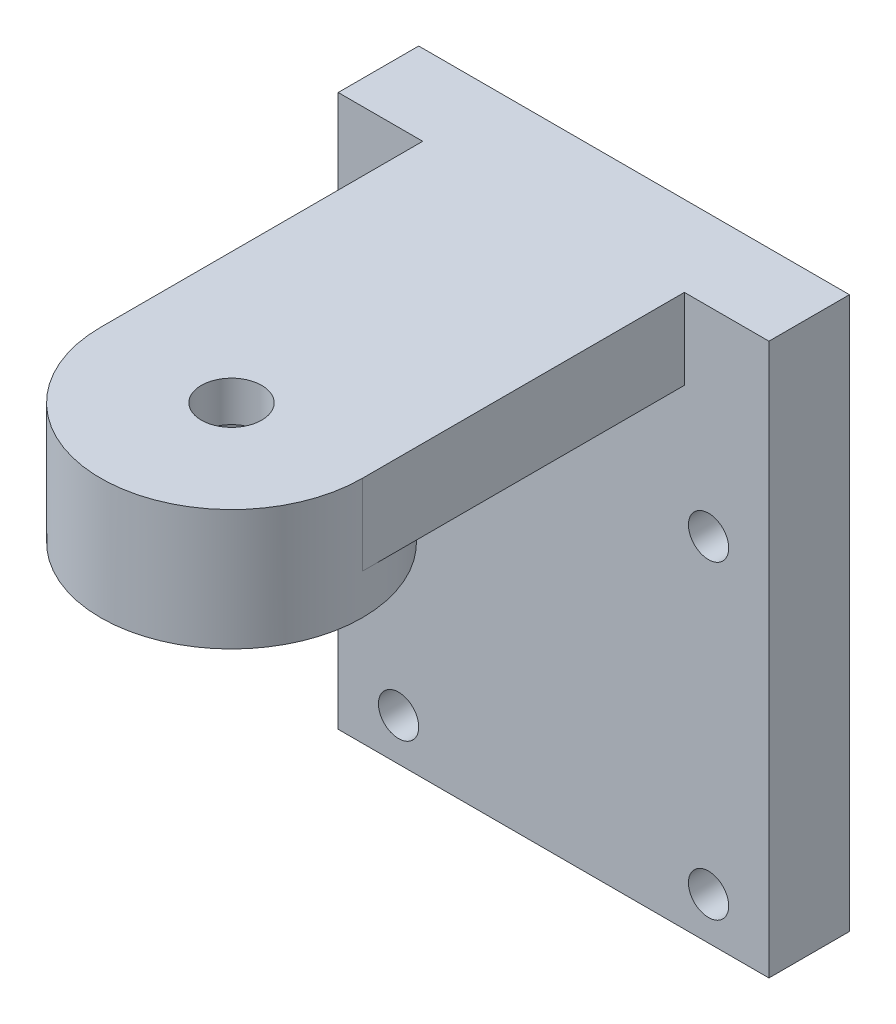
ISO-10303-21;
HEADER;
FILE_DESCRIPTION(('STEP AP214'),'2;1');
FILE_NAME('part.step','',(''),(''),'','','');
FILE_SCHEMA(('AUTOMOTIVE_DESIGN { 1 0 10303 214 1 1 1 1 }'));
ENDSEC;
DATA;
#1=APPLICATION_CONTEXT('core data for automotive mechanical design processes');
#2=APPLICATION_PROTOCOL_DEFINITION('international standard','automotive_design',2000,#1);
#3=PRODUCT_CONTEXT('',#1,'mechanical');
#4=PRODUCT('Part','Part','',(#3));
#5=PRODUCT_RELATED_PRODUCT_CATEGORY('part','',(#4));
#6=PRODUCT_DEFINITION_FORMATION('','',#4);
#7=PRODUCT_DEFINITION_CONTEXT('part definition',#1,'design');
#8=PRODUCT_DEFINITION('design','',#6,#7);
#9=PRODUCT_DEFINITION_SHAPE('','',#8);
#10=(LENGTH_UNIT() NAMED_UNIT(*) SI_UNIT(.MILLI.,.METRE.));
#11=(NAMED_UNIT(*) PLANE_ANGLE_UNIT() SI_UNIT($,.RADIAN.));
#12=(NAMED_UNIT(*) SI_UNIT($,.STERADIAN.) SOLID_ANGLE_UNIT());
#13=UNCERTAINTY_MEASURE_WITH_UNIT(LENGTH_MEASURE(1.E-05),#10,'distance_accuracy_value','');
#14=(GEOMETRIC_REPRESENTATION_CONTEXT(3) GLOBAL_UNCERTAINTY_ASSIGNED_CONTEXT((#13)) GLOBAL_UNIT_ASSIGNED_CONTEXT((#10,
#11,#12)) REPRESENTATION_CONTEXT('',''));
#15=CARTESIAN_POINT('',(0.,0.,0.));
#16=DIRECTION('',(0.,0.,1.));
#17=DIRECTION('',(1.,0.,0.));
#18=AXIS2_PLACEMENT_3D('',#15,#16,#17);
#19=CARTESIAN_POINT('',(6.5,2.,0.));
#20=DIRECTION('',(1.,0.,0.));
#21=DIRECTION('',(0.,0.,-1.));
#22=AXIS2_PLACEMENT_3D('',#19,#20,#21);
#23=PLANE('',#22);
#24=DIRECTION('',(0.,0.,-1.));
#25=VECTOR('',#24,1.);
#26=CARTESIAN_POINT('',(6.5,2.,0.));
#27=LINE('',#26,#25);
#28=CARTESIAN_POINT('',(6.5,2.,0.));
#29=VERTEX_POINT('',#28);
#30=CARTESIAN_POINT('',(6.5,2.,-16.));
#31=VERTEX_POINT('',#30);
#32=EDGE_CURVE('E225',#29,#31,#27,.T.);
#33=ORIENTED_EDGE('',*,*,#32,.T.);
#34=DIRECTION('',(0.,-1.,0.));
#35=VECTOR('',#34,1.);
#36=CARTESIAN_POINT('',(6.5,0.,-16.));
#37=LINE('',#36,#35);
#38=CARTESIAN_POINT('',(6.5,6.,-16.));
#39=VERTEX_POINT('',#38);
#40=EDGE_CURVE('E61',#39,#31,#37,.T.);
#41=ORIENTED_EDGE('',*,*,#40,.F.);
#42=DIRECTION('',(0.,0.,-1.));
#43=VECTOR('',#42,1.);
#44=CARTESIAN_POINT('',(6.5,6.,0.));
#45=LINE('',#44,#43);
#46=CARTESIAN_POINT('',(6.5,6.,0.));
#47=VERTEX_POINT('',#46);
#48=EDGE_CURVE('E222',#47,#39,#45,.T.);
#49=ORIENTED_EDGE('',*,*,#48,.F.);
#50=DIRECTION('',(0.,1.,0.));
#51=VECTOR('',#50,1.);
#52=CARTESIAN_POINT('',(6.5,2.,0.));
#53=LINE('',#52,#51);
#54=EDGE_CURVE('E235',#29,#47,#53,.T.);
#55=ORIENTED_EDGE('',*,*,#54,.F.);
#56=EDGE_LOOP('',(#33,#41,#49,#55));
#57=FACE_BOUND('',#56,.T.);
#58=ADVANCED_FACE('F43',(#57),#23,.T.);
#59=CARTESIAN_POINT('',(-6.5,2.,0.));
#60=DIRECTION('',(1.,0.,0.));
#61=DIRECTION('',(0.,0.,-1.));
#62=AXIS2_PLACEMENT_3D('',#59,#60,#61);
#63=PLANE('',#62);
#64=DIRECTION('',(0.,1.,0.));
#65=VECTOR('',#64,1.);
#66=CARTESIAN_POINT('',(-6.5,0.,-16.));
#67=LINE('',#66,#65);
#68=CARTESIAN_POINT('',(-6.5,2.,-16.));
#69=VERTEX_POINT('',#68);
#70=CARTESIAN_POINT('',(-6.5,6.,-16.));
#71=VERTEX_POINT('',#70);
#72=EDGE_CURVE('E193',#69,#71,#67,.T.);
#73=ORIENTED_EDGE('',*,*,#72,.F.);
#74=DIRECTION('',(0.,0.,-1.));
#75=VECTOR('',#74,1.);
#76=CARTESIAN_POINT('',(-6.5,2.,0.));
#77=LINE('',#76,#75);
#78=CARTESIAN_POINT('',(-6.5,2.,0.));
#79=VERTEX_POINT('',#78);
#80=EDGE_CURVE('E217',#79,#69,#77,.T.);
#81=ORIENTED_EDGE('',*,*,#80,.F.);
#82=DIRECTION('',(0.,1.,0.));
#83=VECTOR('',#82,1.);
#84=CARTESIAN_POINT('',(-6.5,2.,0.));
#85=LINE('',#84,#83);
#86=CARTESIAN_POINT('',(-6.5,6.,0.));
#87=VERTEX_POINT('',#86);
#88=EDGE_CURVE('E228',#79,#87,#85,.T.);
#89=ORIENTED_EDGE('',*,*,#88,.T.);
#90=DIRECTION('',(0.,0.,-1.));
#91=VECTOR('',#90,1.);
#92=CARTESIAN_POINT('',(-6.5,6.,0.));
#93=LINE('',#92,#91);
#94=EDGE_CURVE('E69',#87,#71,#93,.T.);
#95=ORIENTED_EDGE('',*,*,#94,.T.);
#96=EDGE_LOOP('',(#73,#81,#89,#95));
#97=FACE_BOUND('',#96,.T.);
#98=ADVANCED_FACE('F355',(#97),#63,.F.);
#99=CARTESIAN_POINT('',(0.,2.,0.));
#100=DIRECTION('',(0.,1.,0.));
#101=DIRECTION('',(0.,0.,1.));
#102=AXIS2_PLACEMENT_3D('',#99,#100,#101);
#103=PLANE('',#102);
#104=DIRECTION('',(-1.,0.,0.));
#105=VECTOR('',#104,1.);
#106=CARTESIAN_POINT('',(0.,2.,-16.));
#107=LINE('',#106,#105);
#108=EDGE_CURVE('E196',#31,#69,#107,.T.);
#109=ORIENTED_EDGE('',*,*,#108,.F.);
#110=ORIENTED_EDGE('',*,*,#32,.F.);
#111=CARTESIAN_POINT('',(0.,2.,0.));
#112=DIRECTION('',(0.,1.,0.));
#113=DIRECTION('',(0.,0.,1.));
#114=AXIS2_PLACEMENT_3D('',#111,#112,#113);
#115=CIRCLE('',#114,6.5);
#116=EDGE_CURVE('E221',#29,#79,#115,.T.);
#117=ORIENTED_EDGE('',*,*,#116,.T.);
#118=ORIENTED_EDGE('',*,*,#80,.T.);
#119=EDGE_LOOP('',(#109,#110,#117,#118));
#120=FACE_BOUND('',#119,.T.);
#121=ADVANCED_FACE('F360',(#120),#103,.F.);
#122=CARTESIAN_POINT('',(0.,6.,0.));
#123=DIRECTION('',(0.,-1.,0.));
#124=DIRECTION('',(0.,0.,-1.));
#125=AXIS2_PLACEMENT_3D('',#122,#123,#124);
#126=CYLINDRICAL_SURFACE('',#125,6.5);
#127=CARTESIAN_POINT('',(0.,0.,0.));
#128=DIRECTION('',(0.,1.,0.));
#129=DIRECTION('',(0.,0.,1.));
#130=AXIS2_PLACEMENT_3D('',#127,#128,#129);
#131=CIRCLE('',#130,6.5);
#132=CARTESIAN_POINT('',(0.,0.,6.5));
#133=VERTEX_POINT('',#132);
#134=EDGE_CURVE('E53',#133,#133,#131,.T.);
#135=ORIENTED_EDGE('',*,*,#134,.T.);
#136=EDGE_LOOP('',(#135));
#137=FACE_BOUND('',#136,.T.);
#138=ORIENTED_EDGE('',*,*,#54,.T.);
#139=CARTESIAN_POINT('',(0.,6.,0.));
#140=DIRECTION('',(0.,1.,0.));
#141=DIRECTION('',(0.,0.,1.));
#142=AXIS2_PLACEMENT_3D('',#139,#140,#141);
#143=CIRCLE('',#142,6.5);
#144=EDGE_CURVE('E11',#87,#47,#143,.T.);
#145=ORIENTED_EDGE('',*,*,#144,.F.);
#146=ORIENTED_EDGE('',*,*,#88,.F.);
#147=ORIENTED_EDGE('',*,*,#116,.F.);
#148=EDGE_LOOP('',(#138,#145,#146,#147));
#149=FACE_BOUND('',#148,.T.);
#150=ADVANCED_FACE('F45',(#137,#149),#126,.T.);
#151=CARTESIAN_POINT('',(0.,0.,0.));
#152=DIRECTION('',(0.,1.,0.));
#153=DIRECTION('',(0.,0.,1.));
#154=AXIS2_PLACEMENT_3D('',#151,#152,#153);
#155=PLANE('',#154);
#156=ORIENTED_EDGE('',*,*,#134,.F.);
#157=EDGE_LOOP('',(#156));
#158=FACE_BOUND('',#157,.T.);
#159=DIRECTION('',(0.5,0.,-0.866025403784439));
#160=VECTOR('',#159,1.);
#161=CARTESIAN_POINT('',(5.,0.,0.));
#162=LINE('',#161,#160);
#163=CARTESIAN_POINT('',(2.5,0.,4.3301270189222));
#164=VERTEX_POINT('',#163);
#165=CARTESIAN_POINT('',(5.,0.,0.));
#166=VERTEX_POINT('',#165);
#167=EDGE_CURVE('E266',#164,#166,#162,.T.);
#168=ORIENTED_EDGE('',*,*,#167,.T.);
#169=DIRECTION('',(-0.500000000000004,0.,-0.866025403784436));
#170=VECTOR('',#169,1.);
#171=CARTESIAN_POINT('',(5.,0.,0.));
#172=LINE('',#171,#170);
#173=CARTESIAN_POINT('',(2.49999999999998,0.,-4.33012701892218));
#174=VERTEX_POINT('',#173);
#175=EDGE_CURVE('E270',#166,#174,#172,.T.);
#176=ORIENTED_EDGE('',*,*,#175,.T.);
#177=DIRECTION('',(-1.,0.,0.));
#178=VECTOR('',#177,1.);
#179=CARTESIAN_POINT('',(2.49999999999998,0.,-4.33012701892218));
#180=LINE('',#179,#178);
#181=CARTESIAN_POINT('',(-2.5,0.,-4.33012701892219));
#182=VERTEX_POINT('',#181);
#183=EDGE_CURVE('E274',#174,#182,#180,.T.);
#184=ORIENTED_EDGE('',*,*,#183,.T.);
#185=DIRECTION('',(-0.500000000000004,0.,0.866025403784436));
#186=VECTOR('',#185,1.);
#187=CARTESIAN_POINT('',(-2.5,0.,-4.33012701892219));
#188=LINE('',#187,#186);
#189=CARTESIAN_POINT('',(-5.00000000000002,0.,0.));
#190=VERTEX_POINT('',#189);
#191=EDGE_CURVE('E278',#182,#190,#188,.T.);
#192=ORIENTED_EDGE('',*,*,#191,.T.);
#193=DIRECTION('',(0.5,0.,0.866025403784439));
#194=VECTOR('',#193,1.);
#195=CARTESIAN_POINT('',(-5.00000000000002,0.,0.));
#196=LINE('',#195,#194);
#197=CARTESIAN_POINT('',(-2.50000000000001,0.,4.3301270189222));
#198=VERTEX_POINT('',#197);
#199=EDGE_CURVE('E282',#190,#198,#196,.T.);
#200=ORIENTED_EDGE('',*,*,#199,.T.);
#201=DIRECTION('',(1.,0.,0.));
#202=VECTOR('',#201,1.);
#203=CARTESIAN_POINT('',(-2.50000000000001,0.,4.3301270189222));
#204=LINE('',#203,#202);
#205=EDGE_CURVE('E250',#198,#164,#204,.T.);
#206=ORIENTED_EDGE('',*,*,#205,.T.);
#207=EDGE_LOOP('',(#168,#176,#184,#192,#200,#206));
#208=FACE_BOUND('',#207,.T.);
#209=ADVANCED_FACE('F313',(#158,#208),#155,.F.);
#210=CARTESIAN_POINT('',(0.,6.,0.));
#211=DIRECTION('',(0.,1.,0.));
#212=DIRECTION('',(0.,0.,1.));
#213=AXIS2_PLACEMENT_3D('',#210,#211,#212);
#214=PLANE('',#213);
#215=CARTESIAN_POINT('',(0.,6.,0.));
#216=DIRECTION('',(0.,1.,0.));
#217=DIRECTION('',(0.,0.,1.));
#218=AXIS2_PLACEMENT_3D('',#215,#216,#217);
#219=CIRCLE('',#218,1.5);
#220=CARTESIAN_POINT('',(0.,6.,1.5));
#221=VERTEX_POINT('',#220);
#222=EDGE_CURVE('E239',#221,#221,#219,.T.);
#223=ORIENTED_EDGE('',*,*,#222,.F.);
#224=EDGE_LOOP('',(#223));
#225=FACE_BOUND('',#224,.T.);
#226=ORIENTED_EDGE('',*,*,#144,.T.);
#227=ORIENTED_EDGE('',*,*,#48,.T.);
#228=DIRECTION('',(1.,0.,0.));
#229=VECTOR('',#228,1.);
#230=CARTESIAN_POINT('',(0.,6.,-16.));
#231=LINE('',#230,#229);
#232=CARTESIAN_POINT('',(10.7,6.,-16.));
#233=VERTEX_POINT('',#232);
#234=EDGE_CURVE('E172',#39,#233,#231,.T.);
#235=ORIENTED_EDGE('',*,*,#234,.T.);
#236=DIRECTION('',(0.,0.,-1.));
#237=VECTOR('',#236,1.);
#238=CARTESIAN_POINT('',(10.7,6.,-16.));
#239=LINE('',#238,#237);
#240=CARTESIAN_POINT('',(10.7,6.,-20.));
#241=VERTEX_POINT('',#240);
#242=EDGE_CURVE('E176',#233,#241,#239,.T.);
#243=ORIENTED_EDGE('',*,*,#242,.T.);
#244=DIRECTION('',(1.,0.,0.));
#245=VECTOR('',#244,1.);
#246=CARTESIAN_POINT('',(0.,6.,-20.));
#247=LINE('',#246,#245);
#248=CARTESIAN_POINT('',(-10.7,6.,-20.));
#249=VERTEX_POINT('',#248);
#250=EDGE_CURVE('E210',#249,#241,#247,.T.);
#251=ORIENTED_EDGE('',*,*,#250,.F.);
#252=DIRECTION('',(0.,0.,-1.));
#253=VECTOR('',#252,1.);
#254=CARTESIAN_POINT('',(-10.7,6.,-16.));
#255=LINE('',#254,#253);
#256=CARTESIAN_POINT('',(-10.7,6.,-16.));
#257=VERTEX_POINT('',#256);
#258=EDGE_CURVE('E211',#257,#249,#255,.T.);
#259=ORIENTED_EDGE('',*,*,#258,.F.);
#260=EDGE_CURVE('E189',#257,#71,#231,.T.);
#261=ORIENTED_EDGE('',*,*,#260,.T.);
#262=ORIENTED_EDGE('',*,*,#94,.F.);
#263=EDGE_LOOP('',(#226,#227,#235,#243,#251,#259,#261,#262));
#264=FACE_BOUND('',#263,.T.);
#265=ADVANCED_FACE('F316',(#225,#264),#214,.T.);
#266=CARTESIAN_POINT('',(5.,4.,0.));
#267=DIRECTION('',(-0.866025403784439,0.,-0.499999999999999));
#268=DIRECTION('',(-0.499999999999999,0.,0.866025403784439));
#269=AXIS2_PLACEMENT_3D('',#266,#267,#268);
#270=PLANE('',#269);
#271=ORIENTED_EDGE('',*,*,#167,.F.);
#272=DIRECTION('',(0.,-1.,0.));
#273=VECTOR('',#272,1.);
#274=CARTESIAN_POINT('',(2.5,4.,4.3301270189222));
#275=LINE('',#274,#273);
#276=CARTESIAN_POINT('',(2.5,4.,4.3301270189222));
#277=VERTEX_POINT('',#276);
#278=EDGE_CURVE('E265',#277,#164,#275,.T.);
#279=ORIENTED_EDGE('',*,*,#278,.F.);
#280=DIRECTION('',(0.5,0.,-0.866025403784439));
#281=VECTOR('',#280,1.);
#282=CARTESIAN_POINT('',(5.,4.,0.));
#283=LINE('',#282,#281);
#284=CARTESIAN_POINT('',(5.,4.,0.));
#285=VERTEX_POINT('',#284);
#286=EDGE_CURVE('E245',#277,#285,#283,.T.);
#287=ORIENTED_EDGE('',*,*,#286,.T.);
#288=DIRECTION('',(0.,-1.,0.));
#289=VECTOR('',#288,1.);
#290=CARTESIAN_POINT('',(5.,4.,0.));
#291=LINE('',#290,#289);
#292=EDGE_CURVE('E304',#285,#166,#291,.T.);
#293=ORIENTED_EDGE('',*,*,#292,.T.);
#294=EDGE_LOOP('',(#271,#279,#287,#293));
#295=FACE_BOUND('',#294,.T.);
#296=ADVANCED_FACE('F320',(#295),#270,.T.);
#297=CARTESIAN_POINT('',(5.,4.,0.));
#298=DIRECTION('',(-0.866025403784436,0.,0.500000000000004));
#299=DIRECTION('',(0.500000000000004,0.,0.866025403784436));
#300=AXIS2_PLACEMENT_3D('',#297,#298,#299);
#301=PLANE('',#300);
#302=ORIENTED_EDGE('',*,*,#175,.F.);
#303=ORIENTED_EDGE('',*,*,#292,.F.);
#304=DIRECTION('',(-0.500000000000004,0.,-0.866025403784436));
#305=VECTOR('',#304,1.);
#306=CARTESIAN_POINT('',(5.,4.,0.));
#307=LINE('',#306,#305);
#308=CARTESIAN_POINT('',(2.49999999999998,4.,-4.33012701892218));
#309=VERTEX_POINT('',#308);
#310=EDGE_CURVE('E249',#285,#309,#307,.T.);
#311=ORIENTED_EDGE('',*,*,#310,.T.);
#312=DIRECTION('',(0.,-1.,0.));
#313=VECTOR('',#312,1.);
#314=CARTESIAN_POINT('',(2.49999999999998,4.,-4.33012701892218));
#315=LINE('',#314,#313);
#316=EDGE_CURVE('E301',#309,#174,#315,.T.);
#317=ORIENTED_EDGE('',*,*,#316,.T.);
#318=EDGE_LOOP('',(#302,#303,#311,#317));
#319=FACE_BOUND('',#318,.T.);
#320=ADVANCED_FACE('F333',(#319),#301,.T.);
#321=CARTESIAN_POINT('',(2.49999999999998,4.,-4.33012701892218));
#322=DIRECTION('',(0.,0.,1.));
#323=DIRECTION('',(1.,0.,0.));
#324=AXIS2_PLACEMENT_3D('',#321,#322,#323);
#325=PLANE('',#324);
#326=ORIENTED_EDGE('',*,*,#183,.F.);
#327=ORIENTED_EDGE('',*,*,#316,.F.);
#328=DIRECTION('',(-1.,0.,0.));
#329=VECTOR('',#328,1.);
#330=CARTESIAN_POINT('',(2.49999999999998,4.,-4.33012701892218));
#331=LINE('',#330,#329);
#332=CARTESIAN_POINT('',(-2.5,4.,-4.33012701892219));
#333=VERTEX_POINT('',#332);
#334=EDGE_CURVE('E253',#309,#333,#331,.T.);
#335=ORIENTED_EDGE('',*,*,#334,.T.);
#336=DIRECTION('',(0.,-1.,0.));
#337=VECTOR('',#336,1.);
#338=CARTESIAN_POINT('',(-2.5,4.,-4.33012701892219));
#339=LINE('',#338,#337);
#340=EDGE_CURVE('E298',#333,#182,#339,.T.);
#341=ORIENTED_EDGE('',*,*,#340,.T.);
#342=EDGE_LOOP('',(#326,#327,#335,#341));
#343=FACE_BOUND('',#342,.T.);
#344=ADVANCED_FACE('F337',(#343),#325,.T.);
#345=CARTESIAN_POINT('',(-2.5,4.,-4.33012701892219));
#346=DIRECTION('',(0.866025403784436,0.,0.500000000000004));
#347=DIRECTION('',(0.500000000000004,0.,-0.866025403784436));
#348=AXIS2_PLACEMENT_3D('',#345,#346,#347);
#349=PLANE('',#348);
#350=ORIENTED_EDGE('',*,*,#191,.F.);
#351=ORIENTED_EDGE('',*,*,#340,.F.);
#352=DIRECTION('',(-0.500000000000004,0.,0.866025403784436));
#353=VECTOR('',#352,1.);
#354=CARTESIAN_POINT('',(-2.5,4.,-4.33012701892219));
#355=LINE('',#354,#353);
#356=CARTESIAN_POINT('',(-5.00000000000002,4.,0.));
#357=VERTEX_POINT('',#356);
#358=EDGE_CURVE('E256',#333,#357,#355,.T.);
#359=ORIENTED_EDGE('',*,*,#358,.T.);
#360=DIRECTION('',(0.,-1.,0.));
#361=VECTOR('',#360,1.);
#362=CARTESIAN_POINT('',(-5.00000000000002,4.,0.));
#363=LINE('',#362,#361);
#364=EDGE_CURVE('E295',#357,#190,#363,.T.);
#365=ORIENTED_EDGE('',*,*,#364,.T.);
#366=EDGE_LOOP('',(#350,#351,#359,#365));
#367=FACE_BOUND('',#366,.T.);
#368=ADVANCED_FACE('F342',(#367),#349,.T.);
#369=CARTESIAN_POINT('',(-5.00000000000002,4.,0.));
#370=DIRECTION('',(0.866025403784439,0.,-0.5));
#371=DIRECTION('',(-0.5,0.,-0.866025403784439));
#372=AXIS2_PLACEMENT_3D('',#369,#370,#371);
#373=PLANE('',#372);
#374=ORIENTED_EDGE('',*,*,#199,.F.);
#375=ORIENTED_EDGE('',*,*,#364,.F.);
#376=DIRECTION('',(0.5,0.,0.866025403784439));
#377=VECTOR('',#376,1.);
#378=CARTESIAN_POINT('',(-5.00000000000002,4.,0.));
#379=LINE('',#378,#377);
#380=CARTESIAN_POINT('',(-2.50000000000001,4.,4.3301270189222));
#381=VERTEX_POINT('',#380);
#382=EDGE_CURVE('E259',#357,#381,#379,.T.);
#383=ORIENTED_EDGE('',*,*,#382,.T.);
#384=DIRECTION('',(0.,-1.,0.));
#385=VECTOR('',#384,1.);
#386=CARTESIAN_POINT('',(-2.50000000000001,4.,4.3301270189222));
#387=LINE('',#386,#385);
#388=EDGE_CURVE('E292',#381,#198,#387,.T.);
#389=ORIENTED_EDGE('',*,*,#388,.T.);
#390=EDGE_LOOP('',(#374,#375,#383,#389));
#391=FACE_BOUND('',#390,.T.);
#392=ADVANCED_FACE('F345',(#391),#373,.T.);
#393=CARTESIAN_POINT('',(-2.50000000000001,4.,4.3301270189222));
#394=DIRECTION('',(0.,0.,-1.));
#395=DIRECTION('',(-1.,0.,0.));
#396=AXIS2_PLACEMENT_3D('',#393,#394,#395);
#397=PLANE('',#396);
#398=ORIENTED_EDGE('',*,*,#205,.F.);
#399=ORIENTED_EDGE('',*,*,#388,.F.);
#400=DIRECTION('',(1.,0.,0.));
#401=VECTOR('',#400,1.);
#402=CARTESIAN_POINT('',(-2.50000000000001,4.,4.3301270189222));
#403=LINE('',#402,#401);
#404=EDGE_CURVE('E262',#381,#277,#403,.T.);
#405=ORIENTED_EDGE('',*,*,#404,.T.);
#406=ORIENTED_EDGE('',*,*,#278,.T.);
#407=EDGE_LOOP('',(#398,#399,#405,#406));
#408=FACE_BOUND('',#407,.T.);
#409=ADVANCED_FACE('F324',(#408),#397,.T.);
#410=CARTESIAN_POINT('',(0.,4.,0.));
#411=DIRECTION('',(0.,1.,0.));
#412=DIRECTION('',(0.,0.,1.));
#413=AXIS2_PLACEMENT_3D('',#410,#411,#412);
#414=PLANE('',#413);
#415=CARTESIAN_POINT('',(0.,4.,0.));
#416=DIRECTION('',(0.,1.,0.));
#417=DIRECTION('',(0.,0.,1.));
#418=AXIS2_PLACEMENT_3D('',#415,#416,#417);
#419=CIRCLE('',#418,1.5);
#420=CARTESIAN_POINT('',(0.,4.,1.5));
#421=VERTEX_POINT('',#420);
#422=EDGE_CURVE('E47',#421,#421,#419,.T.);
#423=ORIENTED_EDGE('',*,*,#422,.T.);
#424=EDGE_LOOP('',(#423));
#425=FACE_BOUND('',#424,.T.);
#426=ORIENTED_EDGE('',*,*,#286,.F.);
#427=ORIENTED_EDGE('',*,*,#404,.F.);
#428=ORIENTED_EDGE('',*,*,#382,.F.);
#429=ORIENTED_EDGE('',*,*,#358,.F.);
#430=ORIENTED_EDGE('',*,*,#334,.F.);
#431=ORIENTED_EDGE('',*,*,#310,.F.);
#432=EDGE_LOOP('',(#426,#427,#428,#429,#430,#431));
#433=FACE_BOUND('',#432,.T.);
#434=ADVANCED_FACE('F329',(#425,#433),#414,.F.);
#435=CARTESIAN_POINT('',(0.,2.,0.));
#436=DIRECTION('',(0.,1.,0.));
#437=DIRECTION('',(0.,0.,1.));
#438=AXIS2_PLACEMENT_3D('',#435,#436,#437);
#439=CYLINDRICAL_SURFACE('',#438,1.5);
#440=ORIENTED_EDGE('',*,*,#222,.T.);
#441=EDGE_LOOP('',(#440));
#442=FACE_BOUND('',#441,.T.);
#443=ORIENTED_EDGE('',*,*,#422,.F.);
#444=EDGE_LOOP('',(#443));
#445=FACE_BOUND('',#444,.T.);
#446=ADVANCED_FACE('F368',(#442,#445),#439,.F.);
#447=CARTESIAN_POINT('',(0.,2.,-20.));
#448=DIRECTION('',(0.,0.,1.));
#449=DIRECTION('',(1.,0.,0.));
#450=AXIS2_PLACEMENT_3D('',#447,#448,#449);
#451=PLANE('',#450);
#452=CARTESIAN_POINT('',(-7.70000000000001,-3.9,-20.));
#453=DIRECTION('',(0.,0.,1.));
#454=DIRECTION('',(1.,0.,0.));
#455=AXIS2_PLACEMENT_3D('',#452,#453,#454);
#456=CIRCLE('',#455,1.);
#457=CARTESIAN_POINT('',(-6.70000000000001,-3.9,-20.));
#458=VERTEX_POINT('',#457);
#459=EDGE_CURVE('E442',#458,#458,#456,.T.);
#460=ORIENTED_EDGE('',*,*,#459,.T.);
#461=EDGE_LOOP('',(#460));
#462=FACE_BOUND('',#461,.T.);
#463=CARTESIAN_POINT('',(7.69999999999999,-3.9,-20.));
#464=DIRECTION('',(0.,0.,1.));
#465=DIRECTION('',(1.,0.,0.));
#466=AXIS2_PLACEMENT_3D('',#463,#464,#465);
#467=CIRCLE('',#466,1.);
#468=CARTESIAN_POINT('',(8.7,-3.9,-20.));
#469=VERTEX_POINT('',#468);
#470=EDGE_CURVE('E430',#469,#469,#467,.T.);
#471=ORIENTED_EDGE('',*,*,#470,.T.);
#472=EDGE_LOOP('',(#471));
#473=FACE_BOUND('',#472,.T.);
#474=CARTESIAN_POINT('',(7.69999999999999,-19.3,-20.));
#475=DIRECTION('',(0.,0.,1.));
#476=DIRECTION('',(1.,0.,0.));
#477=AXIS2_PLACEMENT_3D('',#474,#475,#476);
#478=CIRCLE('',#477,1.);
#479=CARTESIAN_POINT('',(8.7,-19.3,-20.));
#480=VERTEX_POINT('',#479);
#481=EDGE_CURVE('E424',#480,#480,#478,.T.);
#482=ORIENTED_EDGE('',*,*,#481,.T.);
#483=EDGE_LOOP('',(#482));
#484=FACE_BOUND('',#483,.T.);
#485=CARTESIAN_POINT('',(-7.70000000000001,-19.3,-20.));
#486=DIRECTION('',(0.,0.,1.));
#487=DIRECTION('',(1.,0.,0.));
#488=AXIS2_PLACEMENT_3D('',#485,#486,#487);
#489=CIRCLE('',#488,1.);
#490=CARTESIAN_POINT('',(-6.70000000000001,-19.3,-20.));
#491=VERTEX_POINT('',#490);
#492=EDGE_CURVE('E205',#491,#491,#489,.T.);
#493=ORIENTED_EDGE('',*,*,#492,.T.);
#494=EDGE_LOOP('',(#493));
#495=FACE_BOUND('',#494,.T.);
#496=ORIENTED_EDGE('',*,*,#250,.T.);
#497=DIRECTION('',(0.,1.,0.));
#498=VECTOR('',#497,1.);
#499=CARTESIAN_POINT('',(10.7,0.,-20.));
#500=LINE('',#499,#498);
#501=CARTESIAN_POINT('',(10.7,-21.4,-20.));
#502=VERTEX_POINT('',#501);
#503=EDGE_CURVE('E202',#502,#241,#500,.T.);
#504=ORIENTED_EDGE('',*,*,#503,.F.);
#505=DIRECTION('',(1.,0.,0.));
#506=VECTOR('',#505,1.);
#507=CARTESIAN_POINT('',(0.,-21.4,-20.));
#508=LINE('',#507,#506);
#509=CARTESIAN_POINT('',(-10.7,-21.4,-20.));
#510=VERTEX_POINT('',#509);
#511=EDGE_CURVE('E166',#510,#502,#508,.T.);
#512=ORIENTED_EDGE('',*,*,#511,.F.);
#513=DIRECTION('',(0.,-1.,0.));
#514=VECTOR('',#513,1.);
#515=CARTESIAN_POINT('',(-10.7,0.,-20.));
#516=LINE('',#515,#514);
#517=EDGE_CURVE('E179',#249,#510,#516,.T.);
#518=ORIENTED_EDGE('',*,*,#517,.F.);
#519=EDGE_LOOP('',(#496,#504,#512,#518));
#520=FACE_BOUND('',#519,.T.);
#521=ADVANCED_FACE('F365',(#462,#473,#484,#495,#520),#451,.F.);
#522=CARTESIAN_POINT('',(10.7,0.,-16.));
#523=DIRECTION('',(-1.,0.,0.));
#524=DIRECTION('',(0.,0.,1.));
#525=AXIS2_PLACEMENT_3D('',#522,#523,#524);
#526=PLANE('',#525);
#527=ORIENTED_EDGE('',*,*,#503,.T.);
#528=ORIENTED_EDGE('',*,*,#242,.F.);
#529=DIRECTION('',(0.,1.,0.));
#530=VECTOR('',#529,1.);
#531=CARTESIAN_POINT('',(10.7,0.,-16.));
#532=LINE('',#531,#530);
#533=CARTESIAN_POINT('',(10.7,-21.4,-16.));
#534=VERTEX_POINT('',#533);
#535=EDGE_CURVE('E152',#534,#233,#532,.T.);
#536=ORIENTED_EDGE('',*,*,#535,.F.);
#537=DIRECTION('',(0.,0.,-1.));
#538=VECTOR('',#537,1.);
#539=CARTESIAN_POINT('',(10.7,-21.4,-16.));
#540=LINE('',#539,#538);
#541=EDGE_CURVE('E163',#534,#502,#540,.T.);
#542=ORIENTED_EDGE('',*,*,#541,.T.);
#543=EDGE_LOOP('',(#527,#528,#536,#542));
#544=FACE_BOUND('',#543,.T.);
#545=ADVANCED_FACE('F174',(#544),#526,.F.);
#546=CARTESIAN_POINT('',(-10.7,0.,-16.));
#547=DIRECTION('',(1.,0.,0.));
#548=DIRECTION('',(0.,0.,-1.));
#549=AXIS2_PLACEMENT_3D('',#546,#547,#548);
#550=PLANE('',#549);
#551=ORIENTED_EDGE('',*,*,#517,.T.);
#552=DIRECTION('',(0.,0.,-1.));
#553=VECTOR('',#552,1.);
#554=CARTESIAN_POINT('',(-10.7,-21.4,-16.));
#555=LINE('',#554,#553);
#556=CARTESIAN_POINT('',(-10.7,-21.4,-16.));
#557=VERTEX_POINT('',#556);
#558=EDGE_CURVE('E171',#557,#510,#555,.T.);
#559=ORIENTED_EDGE('',*,*,#558,.F.);
#560=DIRECTION('',(0.,-1.,0.));
#561=VECTOR('',#560,1.);
#562=CARTESIAN_POINT('',(-10.7,0.,-16.));
#563=LINE('',#562,#561);
#564=EDGE_CURVE('E156',#257,#557,#563,.T.);
#565=ORIENTED_EDGE('',*,*,#564,.F.);
#566=ORIENTED_EDGE('',*,*,#258,.T.);
#567=EDGE_LOOP('',(#551,#559,#565,#566));
#568=FACE_BOUND('',#567,.T.);
#569=ADVANCED_FACE('F391',(#568),#550,.F.);
#570=CARTESIAN_POINT('',(0.,-21.4,-16.));
#571=DIRECTION('',(0.,1.,0.));
#572=DIRECTION('',(-1.,0.,0.));
#573=AXIS2_PLACEMENT_3D('',#570,#571,#572);
#574=PLANE('',#573);
#575=ORIENTED_EDGE('',*,*,#511,.T.);
#576=ORIENTED_EDGE('',*,*,#541,.F.);
#577=DIRECTION('',(1.,0.,0.));
#578=VECTOR('',#577,1.);
#579=CARTESIAN_POINT('',(0.,-21.4,-16.));
#580=LINE('',#579,#578);
#581=EDGE_CURVE('E147',#557,#534,#580,.T.);
#582=ORIENTED_EDGE('',*,*,#581,.F.);
#583=ORIENTED_EDGE('',*,*,#558,.T.);
#584=EDGE_LOOP('',(#575,#576,#582,#583));
#585=FACE_BOUND('',#584,.T.);
#586=ADVANCED_FACE('F164',(#585),#574,.F.);
#587=CARTESIAN_POINT('',(0.,0.,-16.));
#588=DIRECTION('',(0.,0.,-1.));
#589=DIRECTION('',(-1.,0.,0.));
#590=AXIS2_PLACEMENT_3D('',#587,#588,#589);
#591=PLANE('',#590);
#592=CARTESIAN_POINT('',(-7.70000000000001,-3.9,-16.));
#593=DIRECTION('',(0.,0.,1.));
#594=DIRECTION('',(1.,0.,0.));
#595=AXIS2_PLACEMENT_3D('',#592,#593,#594);
#596=CIRCLE('',#595,1.);
#597=CARTESIAN_POINT('',(-6.70000000000001,-3.9,-16.));
#598=VERTEX_POINT('',#597);
#599=EDGE_CURVE('E446',#598,#598,#596,.T.);
#600=ORIENTED_EDGE('',*,*,#599,.F.);
#601=EDGE_LOOP('',(#600));
#602=FACE_BOUND('',#601,.T.);
#603=CARTESIAN_POINT('',(7.69999999999999,-3.9,-16.));
#604=DIRECTION('',(0.,0.,1.));
#605=DIRECTION('',(1.,0.,0.));
#606=AXIS2_PLACEMENT_3D('',#603,#604,#605);
#607=CIRCLE('',#606,1.);
#608=CARTESIAN_POINT('',(8.7,-3.9,-16.));
#609=VERTEX_POINT('',#608);
#610=EDGE_CURVE('E436',#609,#609,#607,.T.);
#611=ORIENTED_EDGE('',*,*,#610,.F.);
#612=EDGE_LOOP('',(#611));
#613=FACE_BOUND('',#612,.T.);
#614=CARTESIAN_POINT('',(7.69999999999999,-19.3,-16.));
#615=DIRECTION('',(0.,0.,1.));
#616=DIRECTION('',(1.,0.,0.));
#617=AXIS2_PLACEMENT_3D('',#614,#615,#616);
#618=CIRCLE('',#617,1.);
#619=CARTESIAN_POINT('',(8.7,-19.3,-16.));
#620=VERTEX_POINT('',#619);
#621=EDGE_CURVE('E427',#620,#620,#618,.T.);
#622=ORIENTED_EDGE('',*,*,#621,.F.);
#623=EDGE_LOOP('',(#622));
#624=FACE_BOUND('',#623,.T.);
#625=CARTESIAN_POINT('',(-7.70000000000001,-19.3,-16.));
#626=DIRECTION('',(0.,0.,1.));
#627=DIRECTION('',(1.,0.,0.));
#628=AXIS2_PLACEMENT_3D('',#625,#626,#627);
#629=CIRCLE('',#628,1.);
#630=CARTESIAN_POINT('',(-6.70000000000001,-19.3,-16.));
#631=VERTEX_POINT('',#630);
#632=EDGE_CURVE('E184',#631,#631,#629,.T.);
#633=ORIENTED_EDGE('',*,*,#632,.F.);
#634=EDGE_LOOP('',(#633));
#635=FACE_BOUND('',#634,.T.);
#636=ORIENTED_EDGE('',*,*,#535,.T.);
#637=ORIENTED_EDGE('',*,*,#234,.F.);
#638=ORIENTED_EDGE('',*,*,#40,.T.);
#639=ORIENTED_EDGE('',*,*,#108,.T.);
#640=ORIENTED_EDGE('',*,*,#72,.T.);
#641=ORIENTED_EDGE('',*,*,#260,.F.);
#642=ORIENTED_EDGE('',*,*,#564,.T.);
#643=ORIENTED_EDGE('',*,*,#581,.T.);
#644=EDGE_LOOP('',(#636,#637,#638,#639,#640,#641,#642,#643));
#645=FACE_BOUND('',#644,.T.);
#646=ADVANCED_FACE('F149',(#602,#613,#624,#635,#645),#591,.F.);
#647=CARTESIAN_POINT('',(-7.70000000000001,-19.3,-20.));
#648=DIRECTION('',(0.,0.,1.));
#649=DIRECTION('',(1.,0.,0.));
#650=AXIS2_PLACEMENT_3D('',#647,#648,#649);
#651=CYLINDRICAL_SURFACE('',#650,1.);
#652=ORIENTED_EDGE('',*,*,#492,.F.);
#653=EDGE_LOOP('',(#652));
#654=FACE_BOUND('',#653,.T.);
#655=ORIENTED_EDGE('',*,*,#632,.T.);
#656=EDGE_LOOP('',(#655));
#657=FACE_BOUND('',#656,.T.);
#658=ADVANCED_FACE('F403',(#654,#657),#651,.F.);
#659=CARTESIAN_POINT('',(7.69999999999999,-19.3,-20.));
#660=DIRECTION('',(0.,0.,1.));
#661=DIRECTION('',(1.,0.,0.));
#662=AXIS2_PLACEMENT_3D('',#659,#660,#661);
#663=CYLINDRICAL_SURFACE('',#662,1.);
#664=ORIENTED_EDGE('',*,*,#481,.F.);
#665=EDGE_LOOP('',(#664));
#666=FACE_BOUND('',#665,.T.);
#667=ORIENTED_EDGE('',*,*,#621,.T.);
#668=EDGE_LOOP('',(#667));
#669=FACE_BOUND('',#668,.T.);
#670=ADVANCED_FACE('F407',(#666,#669),#663,.F.);
#671=CARTESIAN_POINT('',(7.69999999999999,-3.9,-20.));
#672=DIRECTION('',(0.,0.,1.));
#673=DIRECTION('',(1.,0.,0.));
#674=AXIS2_PLACEMENT_3D('',#671,#672,#673);
#675=CYLINDRICAL_SURFACE('',#674,1.);
#676=ORIENTED_EDGE('',*,*,#470,.F.);
#677=EDGE_LOOP('',(#676));
#678=FACE_BOUND('',#677,.T.);
#679=ORIENTED_EDGE('',*,*,#610,.T.);
#680=EDGE_LOOP('',(#679));
#681=FACE_BOUND('',#680,.T.);
#682=ADVANCED_FACE('F412',(#678,#681),#675,.F.);
#683=CARTESIAN_POINT('',(-7.70000000000001,-3.9,-20.));
#684=DIRECTION('',(0.,0.,1.));
#685=DIRECTION('',(1.,0.,0.));
#686=AXIS2_PLACEMENT_3D('',#683,#684,#685);
#687=CYLINDRICAL_SURFACE('',#686,1.);
#688=ORIENTED_EDGE('',*,*,#459,.F.);
#689=EDGE_LOOP('',(#688));
#690=FACE_BOUND('',#689,.T.);
#691=ORIENTED_EDGE('',*,*,#599,.T.);
#692=EDGE_LOOP('',(#691));
#693=FACE_BOUND('',#692,.T.);
#694=ADVANCED_FACE('F409',(#690,#693),#687,.F.);
#695=CLOSED_SHELL('',(#58,#98,#121,#150,#209,#265,#296,#320,#344,#368,#392,#409,#434,#446,#521,
#545,#569,#586,#646,#658,#670,#682,#694));
#696=MANIFOLD_SOLID_BREP('B2',#695);
#697=ADVANCED_BREP_SHAPE_REPRESENTATION('',(#18,#696),#14);
#698=SHAPE_DEFINITION_REPRESENTATION(#9,#697);
ENDSEC;
END-ISO-10303-21;
